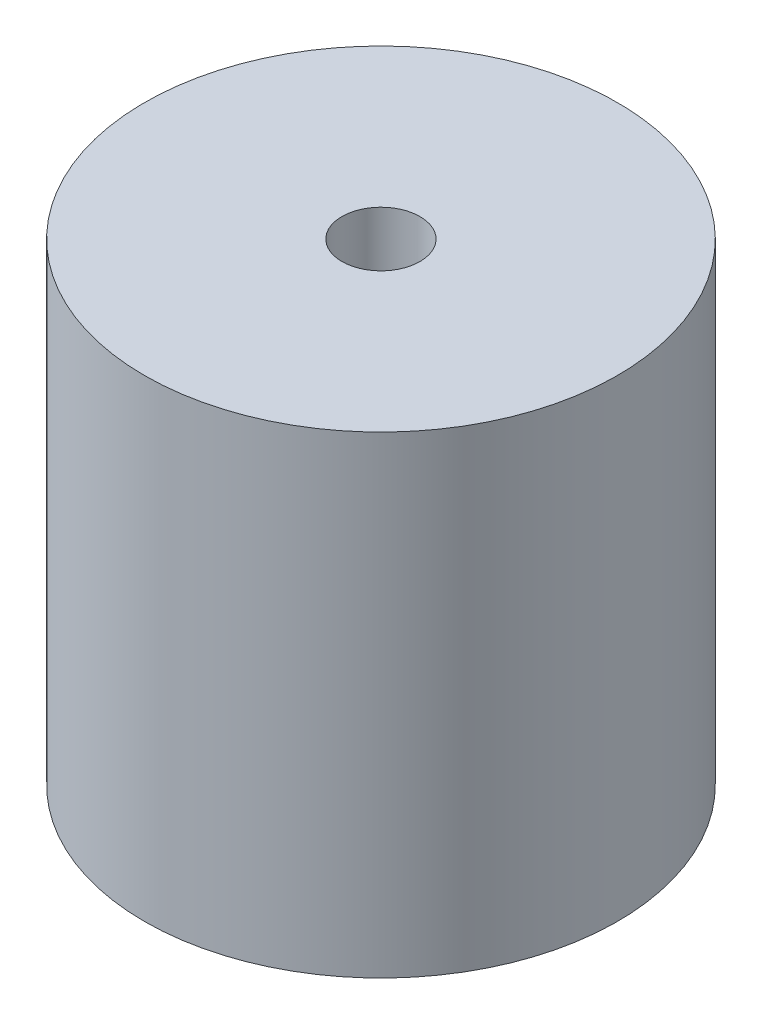
ISO-10303-21;
HEADER;
FILE_DESCRIPTION(('STEP AP214'),'2;1');
FILE_NAME('part.step','',(''),(''),'','','');
FILE_SCHEMA(('AUTOMOTIVE_DESIGN { 1 0 10303 214 1 1 1 1 }'));
ENDSEC;
DATA;
#1=APPLICATION_CONTEXT('core data for automotive mechanical design processes');
#2=APPLICATION_PROTOCOL_DEFINITION('international standard','automotive_design',2000,#1);
#3=PRODUCT_CONTEXT('',#1,'mechanical');
#4=PRODUCT('Part','Part','',(#3));
#5=PRODUCT_RELATED_PRODUCT_CATEGORY('part','',(#4));
#6=PRODUCT_DEFINITION_FORMATION('','',#4);
#7=PRODUCT_DEFINITION_CONTEXT('part definition',#1,'design');
#8=PRODUCT_DEFINITION('design','',#6,#7);
#9=PRODUCT_DEFINITION_SHAPE('','',#8);
#10=(LENGTH_UNIT() NAMED_UNIT(*) SI_UNIT(.MILLI.,.METRE.));
#11=(NAMED_UNIT(*) PLANE_ANGLE_UNIT() SI_UNIT($,.RADIAN.));
#12=(NAMED_UNIT(*) SI_UNIT($,.STERADIAN.) SOLID_ANGLE_UNIT());
#13=UNCERTAINTY_MEASURE_WITH_UNIT(LENGTH_MEASURE(1.E-05),#10,'distance_accuracy_value','');
#14=(GEOMETRIC_REPRESENTATION_CONTEXT(3) GLOBAL_UNCERTAINTY_ASSIGNED_CONTEXT((#13)) GLOBAL_UNIT_ASSIGNED_CONTEXT((#10,
#11,#12)) REPRESENTATION_CONTEXT('',''));
#15=CARTESIAN_POINT('',(0.,0.,0.));
#16=DIRECTION('',(0.,0.,1.));
#17=DIRECTION('',(1.,0.,0.));
#18=AXIS2_PLACEMENT_3D('',#15,#16,#17);
#19=CARTESIAN_POINT('',(0.,200.,0.));
#20=DIRECTION('',(0.,1.,0.));
#21=DIRECTION('',(0.,0.,1.));
#22=AXIS2_PLACEMENT_3D('',#19,#20,#21);
#23=PLANE('',#22);
#24=CARTESIAN_POINT('',(0.,200.,0.));
#25=DIRECTION('',(0.,1.,0.));
#26=DIRECTION('',(0.,0.,1.));
#27=AXIS2_PLACEMENT_3D('',#24,#25,#26);
#28=CIRCLE('',#27,100.);
#29=CARTESIAN_POINT('',(0.,200.,100.));
#30=VERTEX_POINT('',#29);
#31=EDGE_CURVE('E10',#30,#30,#28,.T.);
#32=ORIENTED_EDGE('',*,*,#31,.T.);
#33=EDGE_LOOP('',(#32));
#34=FACE_BOUND('',#33,.T.);
#35=CARTESIAN_POINT('',(0.,200.,0.));
#36=DIRECTION('',(0.,1.,0.));
#37=DIRECTION('',(0.,0.,1.));
#38=AXIS2_PLACEMENT_3D('',#35,#36,#37);
#39=CIRCLE('',#38,16.5);
#40=CARTESIAN_POINT('',(0.,200.,16.5));
#41=VERTEX_POINT('',#40);
#42=EDGE_CURVE('E50',#41,#41,#39,.T.);
#43=ORIENTED_EDGE('',*,*,#42,.F.);
#44=EDGE_LOOP('',(#43));
#45=FACE_BOUND('',#44,.T.);
#46=ADVANCED_FACE('F37',(#34,#45),#23,.T.);
#47=CARTESIAN_POINT('',(0.,0.,0.));
#48=DIRECTION('',(0.,1.,0.));
#49=DIRECTION('',(0.,0.,1.));
#50=AXIS2_PLACEMENT_3D('',#47,#48,#49);
#51=PLANE('',#50);
#52=CARTESIAN_POINT('',(0.,0.,0.));
#53=DIRECTION('',(0.,1.,0.));
#54=DIRECTION('',(0.,0.,1.));
#55=AXIS2_PLACEMENT_3D('',#52,#53,#54);
#56=CIRCLE('',#55,100.);
#57=CARTESIAN_POINT('',(0.,0.,100.));
#58=VERTEX_POINT('',#57);
#59=EDGE_CURVE('E41',#58,#58,#56,.T.);
#60=ORIENTED_EDGE('',*,*,#59,.F.);
#61=EDGE_LOOP('',(#60));
#62=FACE_BOUND('',#61,.T.);
#63=CARTESIAN_POINT('',(0.,0.,0.));
#64=DIRECTION('',(0.,1.,0.));
#65=DIRECTION('',(0.,0.,1.));
#66=AXIS2_PLACEMENT_3D('',#63,#64,#65);
#67=CIRCLE('',#66,16.5);
#68=CARTESIAN_POINT('',(0.,0.,16.5));
#69=VERTEX_POINT('',#68);
#70=EDGE_CURVE('E52',#69,#69,#67,.T.);
#71=ORIENTED_EDGE('',*,*,#70,.T.);
#72=EDGE_LOOP('',(#71));
#73=FACE_BOUND('',#72,.T.);
#74=ADVANCED_FACE('F64',(#62,#73),#51,.F.);
#75=CARTESIAN_POINT('',(0.,200.,0.));
#76=DIRECTION('',(0.,-1.,0.));
#77=DIRECTION('',(0.,0.,-1.));
#78=AXIS2_PLACEMENT_3D('',#75,#76,#77);
#79=CYLINDRICAL_SURFACE('',#78,100.);
#80=ORIENTED_EDGE('',*,*,#31,.F.);
#81=EDGE_LOOP('',(#80));
#82=FACE_BOUND('',#81,.T.);
#83=ORIENTED_EDGE('',*,*,#59,.T.);
#84=EDGE_LOOP('',(#83));
#85=FACE_BOUND('',#84,.T.);
#86=ADVANCED_FACE('F39',(#82,#85),#79,.T.);
#87=CARTESIAN_POINT('',(0.,200.,0.));
#88=DIRECTION('',(0.,-1.,0.));
#89=DIRECTION('',(0.,0.,-1.));
#90=AXIS2_PLACEMENT_3D('',#87,#88,#89);
#91=CYLINDRICAL_SURFACE('',#90,16.5);
#92=ORIENTED_EDGE('',*,*,#42,.T.);
#93=EDGE_LOOP('',(#92));
#94=FACE_BOUND('',#93,.T.);
#95=ORIENTED_EDGE('',*,*,#70,.F.);
#96=EDGE_LOOP('',(#95));
#97=FACE_BOUND('',#96,.T.);
#98=ADVANCED_FACE('F60',(#94,#97),#91,.F.);
#99=CLOSED_SHELL('',(#46,#74,#86,#98));
#100=MANIFOLD_SOLID_BREP('B2',#99);
#101=ADVANCED_BREP_SHAPE_REPRESENTATION('',(#18,#100),#14);
#102=SHAPE_DEFINITION_REPRESENTATION(#9,#101);
ENDSEC;
END-ISO-10303-21;
